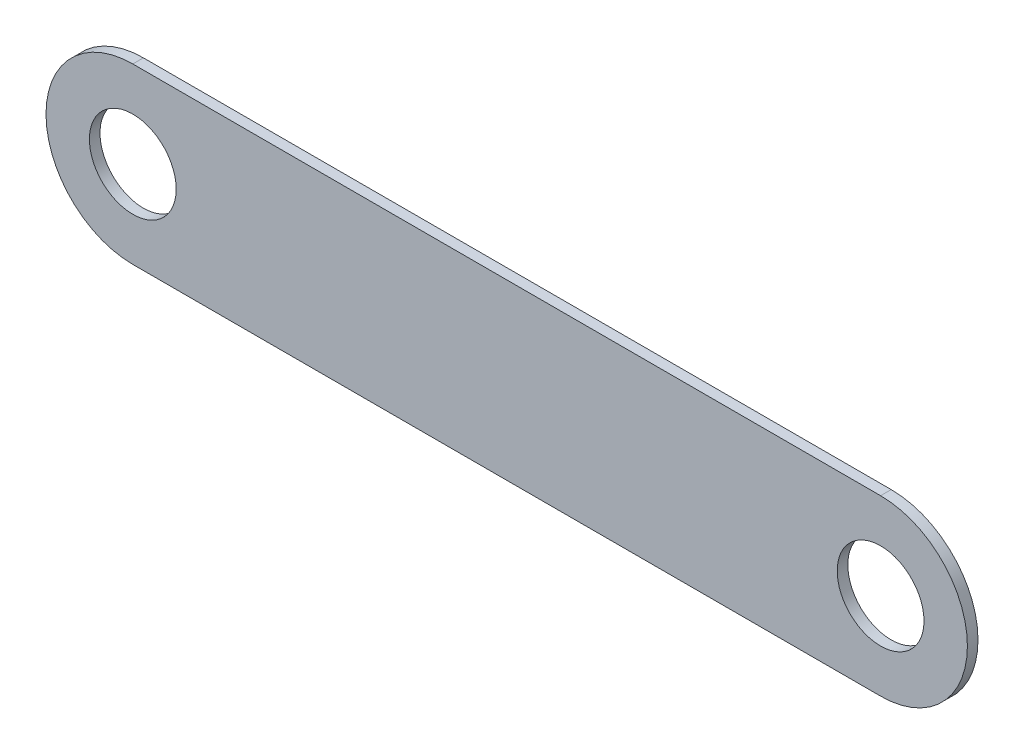
ISO-10303-21;
HEADER;
FILE_DESCRIPTION(('STEP AP214'),'2;1');
FILE_NAME('part.step','',(''),(''),'','','');
FILE_SCHEMA(('AUTOMOTIVE_DESIGN { 1 0 10303 214 1 1 1 1 }'));
ENDSEC;
DATA;
#1=APPLICATION_CONTEXT('core data for automotive mechanical design processes');
#2=APPLICATION_PROTOCOL_DEFINITION('international standard','automotive_design',2000,#1);
#3=PRODUCT_CONTEXT('',#1,'mechanical');
#4=PRODUCT('Part','Part','',(#3));
#5=PRODUCT_RELATED_PRODUCT_CATEGORY('part','',(#4));
#6=PRODUCT_DEFINITION_FORMATION('','',#4);
#7=PRODUCT_DEFINITION_CONTEXT('part definition',#1,'design');
#8=PRODUCT_DEFINITION('design','',#6,#7);
#9=PRODUCT_DEFINITION_SHAPE('','',#8);
#10=(LENGTH_UNIT() NAMED_UNIT(*) SI_UNIT(.MILLI.,.METRE.));
#11=(NAMED_UNIT(*) PLANE_ANGLE_UNIT() SI_UNIT($,.RADIAN.));
#12=(NAMED_UNIT(*) SI_UNIT($,.STERADIAN.) SOLID_ANGLE_UNIT());
#13=UNCERTAINTY_MEASURE_WITH_UNIT(LENGTH_MEASURE(1.E-05),#10,'distance_accuracy_value','');
#14=(GEOMETRIC_REPRESENTATION_CONTEXT(3) GLOBAL_UNCERTAINTY_ASSIGNED_CONTEXT((#13)) GLOBAL_UNIT_ASSIGNED_CONTEXT((#10,
#11,#12)) REPRESENTATION_CONTEXT('',''));
#15=CARTESIAN_POINT('',(0.,0.,0.));
#16=DIRECTION('',(0.,0.,1.));
#17=DIRECTION('',(1.,0.,0.));
#18=AXIS2_PLACEMENT_3D('',#15,#16,#17);
#19=CARTESIAN_POINT('',(0.,0.,1.5875));
#20=DIRECTION('',(0.,0.,1.));
#21=DIRECTION('',(1.,0.,0.));
#22=AXIS2_PLACEMENT_3D('',#19,#20,#21);
#23=PLANE('',#22);
#24=CARTESIAN_POINT('',(0.,0.,1.5875));
#25=DIRECTION('',(0.,0.,1.));
#26=DIRECTION('',(1.,0.,0.));
#27=AXIS2_PLACEMENT_3D('',#24,#25,#26);
#28=CIRCLE('',#27,6.5);
#29=CARTESIAN_POINT('',(6.5,0.,1.5875));
#30=VERTEX_POINT('',#29);
#31=EDGE_CURVE('E115',#30,#30,#28,.T.);
#32=ORIENTED_EDGE('',*,*,#31,.F.);
#33=EDGE_LOOP('',(#32));
#34=FACE_BOUND('',#33,.T.);
#35=CARTESIAN_POINT('',(0.,0.,1.5875));
#36=DIRECTION('',(0.,0.,1.));
#37=DIRECTION('',(1.,0.,0.));
#38=AXIS2_PLACEMENT_3D('',#35,#36,#37);
#39=CIRCLE('',#38,13.);
#40=CARTESIAN_POINT('',(0.,13.,1.5875));
#41=VERTEX_POINT('',#40);
#42=CARTESIAN_POINT('',(0.,-13.,1.5875));
#43=VERTEX_POINT('',#42);
#44=EDGE_CURVE('E97',#41,#43,#39,.T.);
#45=ORIENTED_EDGE('',*,*,#44,.T.);
#46=DIRECTION('',(1.,0.,0.));
#47=VECTOR('',#46,1.);
#48=CARTESIAN_POINT('',(0.,-13.,1.5875));
#49=LINE('',#48,#47);
#50=CARTESIAN_POINT('',(112.,-13.,1.5875));
#51=VERTEX_POINT('',#50);
#52=EDGE_CURVE('E92',#43,#51,#49,.T.);
#53=ORIENTED_EDGE('',*,*,#52,.T.);
#54=CARTESIAN_POINT('',(112.,0.,1.5875));
#55=DIRECTION('',(0.,0.,1.));
#56=DIRECTION('',(1.,0.,0.));
#57=AXIS2_PLACEMENT_3D('',#54,#55,#56);
#58=CIRCLE('',#57,13.);
#59=CARTESIAN_POINT('',(112.,13.,1.5875));
#60=VERTEX_POINT('',#59);
#61=EDGE_CURVE('E95',#51,#60,#58,.T.);
#62=ORIENTED_EDGE('',*,*,#61,.T.);
#63=DIRECTION('',(-1.,0.,0.));
#64=VECTOR('',#63,1.);
#65=CARTESIAN_POINT('',(0.,13.,1.5875));
#66=LINE('',#65,#64);
#67=EDGE_CURVE('E62',#60,#41,#66,.T.);
#68=ORIENTED_EDGE('',*,*,#67,.T.);
#69=EDGE_LOOP('',(#45,#53,#62,#68));
#70=FACE_BOUND('',#69,.T.);
#71=CARTESIAN_POINT('',(112.,0.,1.5875));
#72=DIRECTION('',(0.,0.,1.));
#73=DIRECTION('',(1.,0.,0.));
#74=AXIS2_PLACEMENT_3D('',#71,#72,#73);
#75=CIRCLE('',#74,6.5);
#76=CARTESIAN_POINT('',(118.5,0.,1.5875));
#77=VERTEX_POINT('',#76);
#78=EDGE_CURVE('E135',#77,#77,#75,.T.);
#79=ORIENTED_EDGE('',*,*,#78,.F.);
#80=EDGE_LOOP('',(#79));
#81=FACE_BOUND('',#80,.T.);
#82=ADVANCED_FACE('F43',(#34,#70,#81),#23,.T.);
#83=CARTESIAN_POINT('',(0.,0.,0.));
#84=DIRECTION('',(0.,0.,1.));
#85=DIRECTION('',(1.,0.,0.));
#86=AXIS2_PLACEMENT_3D('',#83,#84,#85);
#87=PLANE('',#86);
#88=CARTESIAN_POINT('',(0.,0.,0.));
#89=DIRECTION('',(0.,0.,1.));
#90=DIRECTION('',(1.,0.,0.));
#91=AXIS2_PLACEMENT_3D('',#88,#89,#90);
#92=CIRCLE('',#91,13.);
#93=CARTESIAN_POINT('',(0.,13.,0.));
#94=VERTEX_POINT('',#93);
#95=CARTESIAN_POINT('',(0.,-13.,0.));
#96=VERTEX_POINT('',#95);
#97=EDGE_CURVE('E111',#94,#96,#92,.T.);
#98=ORIENTED_EDGE('',*,*,#97,.F.);
#99=DIRECTION('',(-1.,0.,0.));
#100=VECTOR('',#99,1.);
#101=CARTESIAN_POINT('',(0.,13.,0.));
#102=LINE('',#101,#100);
#103=CARTESIAN_POINT('',(112.,13.,0.));
#104=VERTEX_POINT('',#103);
#105=EDGE_CURVE('E85',#104,#94,#102,.T.);
#106=ORIENTED_EDGE('',*,*,#105,.F.);
#107=CARTESIAN_POINT('',(112.,0.,0.));
#108=DIRECTION('',(0.,0.,1.));
#109=DIRECTION('',(1.,0.,0.));
#110=AXIS2_PLACEMENT_3D('',#107,#108,#109);
#111=CIRCLE('',#110,13.);
#112=CARTESIAN_POINT('',(112.,-13.,0.));
#113=VERTEX_POINT('',#112);
#114=EDGE_CURVE('E79',#113,#104,#111,.T.);
#115=ORIENTED_EDGE('',*,*,#114,.F.);
#116=DIRECTION('',(1.,0.,0.));
#117=VECTOR('',#116,1.);
#118=CARTESIAN_POINT('',(0.,-13.,0.));
#119=LINE('',#118,#117);
#120=EDGE_CURVE('E102',#96,#113,#119,.T.);
#121=ORIENTED_EDGE('',*,*,#120,.F.);
#122=EDGE_LOOP('',(#98,#106,#115,#121));
#123=FACE_BOUND('',#122,.T.);
#124=CARTESIAN_POINT('',(0.,0.,0.));
#125=DIRECTION('',(0.,0.,1.));
#126=DIRECTION('',(1.,0.,0.));
#127=AXIS2_PLACEMENT_3D('',#124,#125,#126);
#128=CIRCLE('',#127,6.5);
#129=CARTESIAN_POINT('',(6.5,0.,0.));
#130=VERTEX_POINT('',#129);
#131=EDGE_CURVE('E131',#130,#130,#128,.T.);
#132=ORIENTED_EDGE('',*,*,#131,.T.);
#133=EDGE_LOOP('',(#132));
#134=FACE_BOUND('',#133,.T.);
#135=CARTESIAN_POINT('',(112.,0.,0.));
#136=DIRECTION('',(0.,0.,1.));
#137=DIRECTION('',(1.,0.,0.));
#138=AXIS2_PLACEMENT_3D('',#135,#136,#137);
#139=CIRCLE('',#138,6.5);
#140=CARTESIAN_POINT('',(118.5,0.,0.));
#141=VERTEX_POINT('',#140);
#142=EDGE_CURVE('E139',#141,#141,#139,.T.);
#143=ORIENTED_EDGE('',*,*,#142,.T.);
#144=EDGE_LOOP('',(#143));
#145=FACE_BOUND('',#144,.T.);
#146=ADVANCED_FACE('F126',(#123,#134,#145),#87,.F.);
#147=CARTESIAN_POINT('',(0.,0.,1.5875));
#148=DIRECTION('',(0.,0.,-1.));
#149=DIRECTION('',(-1.,0.,0.));
#150=AXIS2_PLACEMENT_3D('',#147,#148,#149);
#151=CYLINDRICAL_SURFACE('',#150,13.);
#152=ORIENTED_EDGE('',*,*,#97,.T.);
#153=DIRECTION('',(0.,0.,-1.));
#154=VECTOR('',#153,1.);
#155=CARTESIAN_POINT('',(0.,-13.,1.5875));
#156=LINE('',#155,#154);
#157=EDGE_CURVE('E11',#43,#96,#156,.T.);
#158=ORIENTED_EDGE('',*,*,#157,.F.);
#159=ORIENTED_EDGE('',*,*,#44,.F.);
#160=DIRECTION('',(0.,0.,-1.));
#161=VECTOR('',#160,1.);
#162=CARTESIAN_POINT('',(0.,13.,1.5875));
#163=LINE('',#162,#161);
#164=EDGE_CURVE('E107',#41,#94,#163,.T.);
#165=ORIENTED_EDGE('',*,*,#164,.T.);
#166=EDGE_LOOP('',(#152,#158,#159,#165));
#167=FACE_BOUND('',#166,.T.);
#168=ADVANCED_FACE('F45',(#167),#151,.T.);
#169=CARTESIAN_POINT('',(0.,-13.,1.5875));
#170=DIRECTION('',(0.,1.,0.));
#171=DIRECTION('',(-1.,0.,0.));
#172=AXIS2_PLACEMENT_3D('',#169,#170,#171);
#173=PLANE('',#172);
#174=ORIENTED_EDGE('',*,*,#120,.T.);
#175=DIRECTION('',(0.,0.,-1.));
#176=VECTOR('',#175,1.);
#177=CARTESIAN_POINT('',(112.,-13.,1.5875));
#178=LINE('',#177,#176);
#179=EDGE_CURVE('E52',#51,#113,#178,.T.);
#180=ORIENTED_EDGE('',*,*,#179,.F.);
#181=ORIENTED_EDGE('',*,*,#52,.F.);
#182=ORIENTED_EDGE('',*,*,#157,.T.);
#183=EDGE_LOOP('',(#174,#180,#181,#182));
#184=FACE_BOUND('',#183,.T.);
#185=ADVANCED_FACE('F101',(#184),#173,.F.);
#186=CARTESIAN_POINT('',(112.,0.,1.5875));
#187=DIRECTION('',(0.,0.,-1.));
#188=DIRECTION('',(-1.,0.,0.));
#189=AXIS2_PLACEMENT_3D('',#186,#187,#188);
#190=CYLINDRICAL_SURFACE('',#189,13.);
#191=ORIENTED_EDGE('',*,*,#114,.T.);
#192=DIRECTION('',(0.,0.,-1.));
#193=VECTOR('',#192,1.);
#194=CARTESIAN_POINT('',(112.,13.,1.5875));
#195=LINE('',#194,#193);
#196=EDGE_CURVE('E103',#60,#104,#195,.T.);
#197=ORIENTED_EDGE('',*,*,#196,.F.);
#198=ORIENTED_EDGE('',*,*,#61,.F.);
#199=ORIENTED_EDGE('',*,*,#179,.T.);
#200=EDGE_LOOP('',(#191,#197,#198,#199));
#201=FACE_BOUND('',#200,.T.);
#202=ADVANCED_FACE('F104',(#201),#190,.T.);
#203=CARTESIAN_POINT('',(0.,13.,1.5875));
#204=DIRECTION('',(0.,-1.,0.));
#205=DIRECTION('',(1.,0.,0.));
#206=AXIS2_PLACEMENT_3D('',#203,#204,#205);
#207=PLANE('',#206);
#208=ORIENTED_EDGE('',*,*,#105,.T.);
#209=ORIENTED_EDGE('',*,*,#164,.F.);
#210=ORIENTED_EDGE('',*,*,#67,.F.);
#211=ORIENTED_EDGE('',*,*,#196,.T.);
#212=EDGE_LOOP('',(#208,#209,#210,#211));
#213=FACE_BOUND('',#212,.T.);
#214=ADVANCED_FACE('F123',(#213),#207,.F.);
#215=CARTESIAN_POINT('',(0.,0.,1.5875));
#216=DIRECTION('',(0.,0.,-1.));
#217=DIRECTION('',(-1.,0.,0.));
#218=AXIS2_PLACEMENT_3D('',#215,#216,#217);
#219=CYLINDRICAL_SURFACE('',#218,6.5);
#220=ORIENTED_EDGE('',*,*,#31,.T.);
#221=EDGE_LOOP('',(#220));
#222=FACE_BOUND('',#221,.T.);
#223=ORIENTED_EDGE('',*,*,#131,.F.);
#224=EDGE_LOOP('',(#223));
#225=FACE_BOUND('',#224,.T.);
#226=ADVANCED_FACE('F158',(#222,#225),#219,.F.);
#227=CARTESIAN_POINT('',(112.,0.,1.5875));
#228=DIRECTION('',(0.,0.,-1.));
#229=DIRECTION('',(-1.,0.,0.));
#230=AXIS2_PLACEMENT_3D('',#227,#228,#229);
#231=CYLINDRICAL_SURFACE('',#230,6.5);
#232=ORIENTED_EDGE('',*,*,#78,.T.);
#233=EDGE_LOOP('',(#232));
#234=FACE_BOUND('',#233,.T.);
#235=ORIENTED_EDGE('',*,*,#142,.F.);
#236=EDGE_LOOP('',(#235));
#237=FACE_BOUND('',#236,.T.);
#238=ADVANCED_FACE('F147',(#234,#237),#231,.F.);
#239=CLOSED_SHELL('',(#82,#146,#168,#185,#202,#214,#226,#238));
#240=MANIFOLD_SOLID_BREP('B2',#239);
#241=ADVANCED_BREP_SHAPE_REPRESENTATION('',(#18,#240),#14);
#242=SHAPE_DEFINITION_REPRESENTATION(#9,#241);
ENDSEC;
END-ISO-10303-21;
